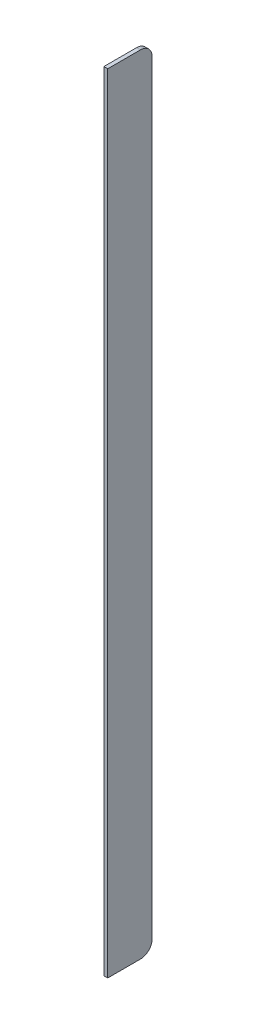
ISO-10303-21;
HEADER;
FILE_DESCRIPTION(('STEP AP214'),'2;1');
FILE_NAME('part.step','',(''),(''),'','','');
FILE_SCHEMA(('AUTOMOTIVE_DESIGN { 1 0 10303 214 1 1 1 1 }'));
ENDSEC;
DATA;
#1=APPLICATION_CONTEXT('core data for automotive mechanical design processes');
#2=APPLICATION_PROTOCOL_DEFINITION('international standard','automotive_design',2000,#1);
#3=PRODUCT_CONTEXT('',#1,'mechanical');
#4=PRODUCT('Part','Part','',(#3));
#5=PRODUCT_RELATED_PRODUCT_CATEGORY('part','',(#4));
#6=PRODUCT_DEFINITION_FORMATION('','',#4);
#7=PRODUCT_DEFINITION_CONTEXT('part definition',#1,'design');
#8=PRODUCT_DEFINITION('design','',#6,#7);
#9=PRODUCT_DEFINITION_SHAPE('','',#8);
#10=(LENGTH_UNIT() NAMED_UNIT(*) SI_UNIT(.MILLI.,.METRE.));
#11=(NAMED_UNIT(*) PLANE_ANGLE_UNIT() SI_UNIT($,.RADIAN.));
#12=(NAMED_UNIT(*) SI_UNIT($,.STERADIAN.) SOLID_ANGLE_UNIT());
#13=UNCERTAINTY_MEASURE_WITH_UNIT(LENGTH_MEASURE(1.E-05),#10,'distance_accuracy_value','');
#14=(GEOMETRIC_REPRESENTATION_CONTEXT(3) GLOBAL_UNCERTAINTY_ASSIGNED_CONTEXT((#13)) GLOBAL_UNIT_ASSIGNED_CONTEXT((#10,
#11,#12)) REPRESENTATION_CONTEXT('',''));
#15=CARTESIAN_POINT('',(0.,0.,0.));
#16=DIRECTION('',(0.,0.,1.));
#17=DIRECTION('',(1.,0.,0.));
#18=AXIS2_PLACEMENT_3D('',#15,#16,#17);
#19=CARTESIAN_POINT('',(-47.0000000000015,99.000000000009,-43.999999999999));
#20=DIRECTION('',(-1.,0.,0.));
#21=DIRECTION('',(0.,-1.,0.));
#22=AXIS2_PLACEMENT_3D('',#19,#20,#21);
#23=CYLINDRICAL_SURFACE('',#22,3.);
#24=CARTESIAN_POINT('',(-48.0000000000014,99.000000000009,-43.999999999999));
#25=DIRECTION('',(-1.,0.,0.));
#26=DIRECTION('',(0.,-1.,0.));
#27=AXIS2_PLACEMENT_3D('',#24,#25,#26);
#28=CIRCLE('',#27,3.);
#29=CARTESIAN_POINT('',(-48.0000000000014,102.000000000009,-43.999999999999));
#30=VERTEX_POINT('',#29);
#31=CARTESIAN_POINT('',(-48.0000000000014,99.000000000009,-46.999999999999));
#32=VERTEX_POINT('',#31);
#33=EDGE_CURVE('E118',#30,#32,#28,.T.);
#34=ORIENTED_EDGE('',*,*,#33,.F.);
#35=DIRECTION('',(-1.,0.,0.));
#36=VECTOR('',#35,1.);
#37=CARTESIAN_POINT('',(-47.0000000000015,102.000000000009,-43.999999999999));
#38=LINE('',#37,#36);
#39=CARTESIAN_POINT('',(-47.0000000000015,102.000000000009,-43.999999999999));
#40=VERTEX_POINT('',#39);
#41=EDGE_CURVE('E11',#40,#30,#38,.T.);
#42=ORIENTED_EDGE('',*,*,#41,.F.);
#43=CARTESIAN_POINT('',(-47.0000000000015,99.000000000009,-43.999999999999));
#44=DIRECTION('',(-1.,0.,0.));
#45=DIRECTION('',(0.,-1.,0.));
#46=AXIS2_PLACEMENT_3D('',#43,#44,#45);
#47=CIRCLE('',#46,3.);
#48=CARTESIAN_POINT('',(-47.0000000000015,99.000000000009,-46.999999999999));
#49=VERTEX_POINT('',#48);
#50=EDGE_CURVE('E132',#40,#49,#47,.T.);
#51=ORIENTED_EDGE('',*,*,#50,.T.);
#52=DIRECTION('',(-1.,0.,0.));
#53=VECTOR('',#52,1.);
#54=CARTESIAN_POINT('',(-47.0000000000015,99.000000000009,-46.999999999999));
#55=LINE('',#54,#53);
#56=EDGE_CURVE('E36',#49,#32,#55,.T.);
#57=ORIENTED_EDGE('',*,*,#56,.T.);
#58=EDGE_LOOP('',(#34,#42,#51,#57));
#59=FACE_BOUND('',#58,.T.);
#60=ADVANCED_FACE('F33',(#59),#23,.T.);
#61=CARTESIAN_POINT('',(-47.0000000000015,102.000000000009,-35.5));
#62=DIRECTION('',(0.,1.,0.));
#63=DIRECTION('',(-1.,0.,0.));
#64=AXIS2_PLACEMENT_3D('',#61,#62,#63);
#65=PLANE('',#64);
#66=DIRECTION('',(0.,0.,-1.));
#67=VECTOR('',#66,1.);
#68=CARTESIAN_POINT('',(-48.0000000000014,102.000000000009,-35.5));
#69=LINE('',#68,#67);
#70=CARTESIAN_POINT('',(-48.0000000000014,102.000000000009,-35.5));
#71=VERTEX_POINT('',#70);
#72=EDGE_CURVE('E130',#71,#30,#69,.T.);
#73=ORIENTED_EDGE('',*,*,#72,.F.);
#74=DIRECTION('',(-1.,0.,0.));
#75=VECTOR('',#74,1.);
#76=CARTESIAN_POINT('',(-47.0000000000015,102.000000000009,-35.5));
#77=LINE('',#76,#75);
#78=CARTESIAN_POINT('',(-47.0000000000015,102.000000000009,-35.5));
#79=VERTEX_POINT('',#78);
#80=EDGE_CURVE('E42',#79,#71,#77,.T.);
#81=ORIENTED_EDGE('',*,*,#80,.F.);
#82=DIRECTION('',(0.,0.,-1.));
#83=VECTOR('',#82,1.);
#84=CARTESIAN_POINT('',(-47.0000000000015,102.000000000009,-35.5));
#85=LINE('',#84,#83);
#86=EDGE_CURVE('E108',#79,#40,#85,.T.);
#87=ORIENTED_EDGE('',*,*,#86,.T.);
#88=ORIENTED_EDGE('',*,*,#41,.T.);
#89=EDGE_LOOP('',(#73,#81,#87,#88));
#90=FACE_BOUND('',#89,.T.);
#91=ADVANCED_FACE('F140',(#90),#65,.T.);
#92=CARTESIAN_POINT('',(-46.9999999999998,-102.00000000001,-35.5000000000007));
#93=DIRECTION('',(0.,0.,1.));
#94=DIRECTION('',(0.,-1.,0.));
#95=AXIS2_PLACEMENT_3D('',#92,#93,#94);
#96=PLANE('',#95);
#97=DIRECTION('',(0.,1.,0.));
#98=VECTOR('',#97,1.);
#99=CARTESIAN_POINT('',(-47.9999999999997,-102.00000000001,-35.5000000000007));
#100=LINE('',#99,#98);
#101=CARTESIAN_POINT('',(-47.9999999999997,-102.00000000001,-35.5000000000007));
#102=VERTEX_POINT('',#101);
#103=EDGE_CURVE('E95',#102,#71,#100,.T.);
#104=ORIENTED_EDGE('',*,*,#103,.F.);
#105=DIRECTION('',(-1.,0.,0.));
#106=VECTOR('',#105,1.);
#107=CARTESIAN_POINT('',(-46.9999999999998,-102.00000000001,-35.5000000000007));
#108=LINE('',#107,#106);
#109=CARTESIAN_POINT('',(-46.9999999999998,-102.00000000001,-35.5000000000007));
#110=VERTEX_POINT('',#109);
#111=EDGE_CURVE('E90',#110,#102,#108,.T.);
#112=ORIENTED_EDGE('',*,*,#111,.F.);
#113=DIRECTION('',(0.,1.,0.));
#114=VECTOR('',#113,1.);
#115=CARTESIAN_POINT('',(-46.9999999999998,-102.00000000001,-35.5000000000007));
#116=LINE('',#115,#114);
#117=EDGE_CURVE('E93',#110,#79,#116,.T.);
#118=ORIENTED_EDGE('',*,*,#117,.T.);
#119=ORIENTED_EDGE('',*,*,#80,.T.);
#120=EDGE_LOOP('',(#104,#112,#118,#119));
#121=FACE_BOUND('',#120,.T.);
#122=ADVANCED_FACE('F92',(#121),#96,.T.);
#123=CARTESIAN_POINT('',(-46.9999999999998,-102.00000000001,-44.0000000000002));
#124=DIRECTION('',(0.,-1.,0.));
#125=DIRECTION('',(1.,0.,0.));
#126=AXIS2_PLACEMENT_3D('',#123,#124,#125);
#127=PLANE('',#126);
#128=DIRECTION('',(0.,0.,1.));
#129=VECTOR('',#128,1.);
#130=CARTESIAN_POINT('',(-47.9999999999997,-102.00000000001,-44.0000000000002));
#131=LINE('',#130,#129);
#132=CARTESIAN_POINT('',(-47.9999999999997,-102.00000000001,-44.0000000000002));
#133=VERTEX_POINT('',#132);
#134=EDGE_CURVE('E127',#133,#102,#131,.T.);
#135=ORIENTED_EDGE('',*,*,#134,.F.);
#136=DIRECTION('',(-1.,0.,0.));
#137=VECTOR('',#136,1.);
#138=CARTESIAN_POINT('',(-46.9999999999998,-102.00000000001,-44.0000000000002));
#139=LINE('',#138,#137);
#140=CARTESIAN_POINT('',(-46.9999999999998,-102.00000000001,-44.0000000000002));
#141=VERTEX_POINT('',#140);
#142=EDGE_CURVE('E100',#141,#133,#139,.T.);
#143=ORIENTED_EDGE('',*,*,#142,.F.);
#144=DIRECTION('',(0.,0.,1.));
#145=VECTOR('',#144,1.);
#146=CARTESIAN_POINT('',(-46.9999999999998,-102.00000000001,-44.0000000000002));
#147=LINE('',#146,#145);
#148=EDGE_CURVE('E106',#141,#110,#147,.T.);
#149=ORIENTED_EDGE('',*,*,#148,.T.);
#150=ORIENTED_EDGE('',*,*,#111,.T.);
#151=EDGE_LOOP('',(#135,#143,#149,#150));
#152=FACE_BOUND('',#151,.T.);
#153=ADVANCED_FACE('F110',(#152),#127,.T.);
#154=CARTESIAN_POINT('',(-46.9999999999998,-99.0000000000098,-44.0000000000002));
#155=DIRECTION('',(-1.,0.,0.));
#156=DIRECTION('',(0.,-1.,0.));
#157=AXIS2_PLACEMENT_3D('',#154,#155,#156);
#158=CYLINDRICAL_SURFACE('',#157,3.00000000000002);
#159=CARTESIAN_POINT('',(-47.9999999999998,-99.0000000000098,-44.0000000000002));
#160=DIRECTION('',(-1.,0.,0.));
#161=DIRECTION('',(0.,-1.,0.));
#162=AXIS2_PLACEMENT_3D('',#159,#160,#161);
#163=CIRCLE('',#162,3.00000000000002);
#164=CARTESIAN_POINT('',(-47.9999999999998,-99.0000000000098,-47.0000000000002));
#165=VERTEX_POINT('',#164);
#166=EDGE_CURVE('E124',#165,#133,#163,.T.);
#167=ORIENTED_EDGE('',*,*,#166,.F.);
#168=DIRECTION('',(-1.,0.,0.));
#169=VECTOR('',#168,1.);
#170=CARTESIAN_POINT('',(-46.9999999999998,-99.0000000000098,-47.0000000000002));
#171=LINE('',#170,#169);
#172=CARTESIAN_POINT('',(-46.9999999999998,-99.0000000000098,-47.0000000000002));
#173=VERTEX_POINT('',#172);
#174=EDGE_CURVE('E135',#173,#165,#171,.T.);
#175=ORIENTED_EDGE('',*,*,#174,.F.);
#176=CARTESIAN_POINT('',(-46.9999999999998,-99.0000000000098,-44.0000000000002));
#177=DIRECTION('',(-1.,0.,0.));
#178=DIRECTION('',(0.,-1.,0.));
#179=AXIS2_PLACEMENT_3D('',#176,#177,#178);
#180=CIRCLE('',#179,3.00000000000002);
#181=EDGE_CURVE('E111',#173,#141,#180,.T.);
#182=ORIENTED_EDGE('',*,*,#181,.T.);
#183=ORIENTED_EDGE('',*,*,#142,.T.);
#184=EDGE_LOOP('',(#167,#175,#182,#183));
#185=FACE_BOUND('',#184,.T.);
#186=ADVANCED_FACE('F153',(#185),#158,.T.);
#187=CARTESIAN_POINT('',(-47.0000000000015,99.000000000009,-46.999999999999));
#188=DIRECTION('',(0.,0.,-1.));
#189=DIRECTION('',(0.,1.,0.));
#190=AXIS2_PLACEMENT_3D('',#187,#188,#189);
#191=PLANE('',#190);
#192=DIRECTION('',(0.,-1.,0.));
#193=VECTOR('',#192,1.);
#194=CARTESIAN_POINT('',(-48.0000000000014,99.000000000009,-46.999999999999));
#195=LINE('',#194,#193);
#196=EDGE_CURVE('E121',#32,#165,#195,.T.);
#197=ORIENTED_EDGE('',*,*,#196,.F.);
#198=ORIENTED_EDGE('',*,*,#56,.F.);
#199=DIRECTION('',(0.,-1.,0.));
#200=VECTOR('',#199,1.);
#201=CARTESIAN_POINT('',(-47.0000000000015,99.000000000009,-46.999999999999));
#202=LINE('',#201,#200);
#203=EDGE_CURVE('E113',#49,#173,#202,.T.);
#204=ORIENTED_EDGE('',*,*,#203,.T.);
#205=ORIENTED_EDGE('',*,*,#174,.T.);
#206=EDGE_LOOP('',(#197,#198,#204,#205));
#207=FACE_BOUND('',#206,.T.);
#208=ADVANCED_FACE('F137',(#207),#191,.T.);
#209=CARTESIAN_POINT('',(-47.0000000000015,99.000000000009,-43.999999999999));
#210=DIRECTION('',(-1.,0.,0.));
#211=DIRECTION('',(0.,-1.,0.));
#212=AXIS2_PLACEMENT_3D('',#209,#210,#211);
#213=PLANE('',#212);
#214=ORIENTED_EDGE('',*,*,#50,.F.);
#215=ORIENTED_EDGE('',*,*,#86,.F.);
#216=ORIENTED_EDGE('',*,*,#117,.F.);
#217=ORIENTED_EDGE('',*,*,#148,.F.);
#218=ORIENTED_EDGE('',*,*,#181,.F.);
#219=ORIENTED_EDGE('',*,*,#203,.F.);
#220=EDGE_LOOP('',(#214,#215,#216,#217,#218,#219));
#221=FACE_BOUND('',#220,.T.);
#222=ADVANCED_FACE('F104',(#221),#213,.F.);
#223=CARTESIAN_POINT('',(-48.0000000000014,99.000000000009,-43.999999999999));
#224=DIRECTION('',(-1.,0.,0.));
#225=DIRECTION('',(0.,-1.,0.));
#226=AXIS2_PLACEMENT_3D('',#223,#224,#225);
#227=PLANE('',#226);
#228=ORIENTED_EDGE('',*,*,#33,.T.);
#229=ORIENTED_EDGE('',*,*,#196,.T.);
#230=ORIENTED_EDGE('',*,*,#166,.T.);
#231=ORIENTED_EDGE('',*,*,#134,.T.);
#232=ORIENTED_EDGE('',*,*,#103,.T.);
#233=ORIENTED_EDGE('',*,*,#72,.T.);
#234=EDGE_LOOP('',(#228,#229,#230,#231,#232,#233));
#235=FACE_BOUND('',#234,.T.);
#236=ADVANCED_FACE('F139',(#235),#227,.T.);
#237=CLOSED_SHELL('',(#60,#91,#122,#153,#186,#208,#222,#236));
#238=MANIFOLD_SOLID_BREP('B2',#237);
#239=ADVANCED_BREP_SHAPE_REPRESENTATION('',(#18,#238),#14);
#240=SHAPE_DEFINITION_REPRESENTATION(#9,#239);
ENDSEC;
END-ISO-10303-21;
